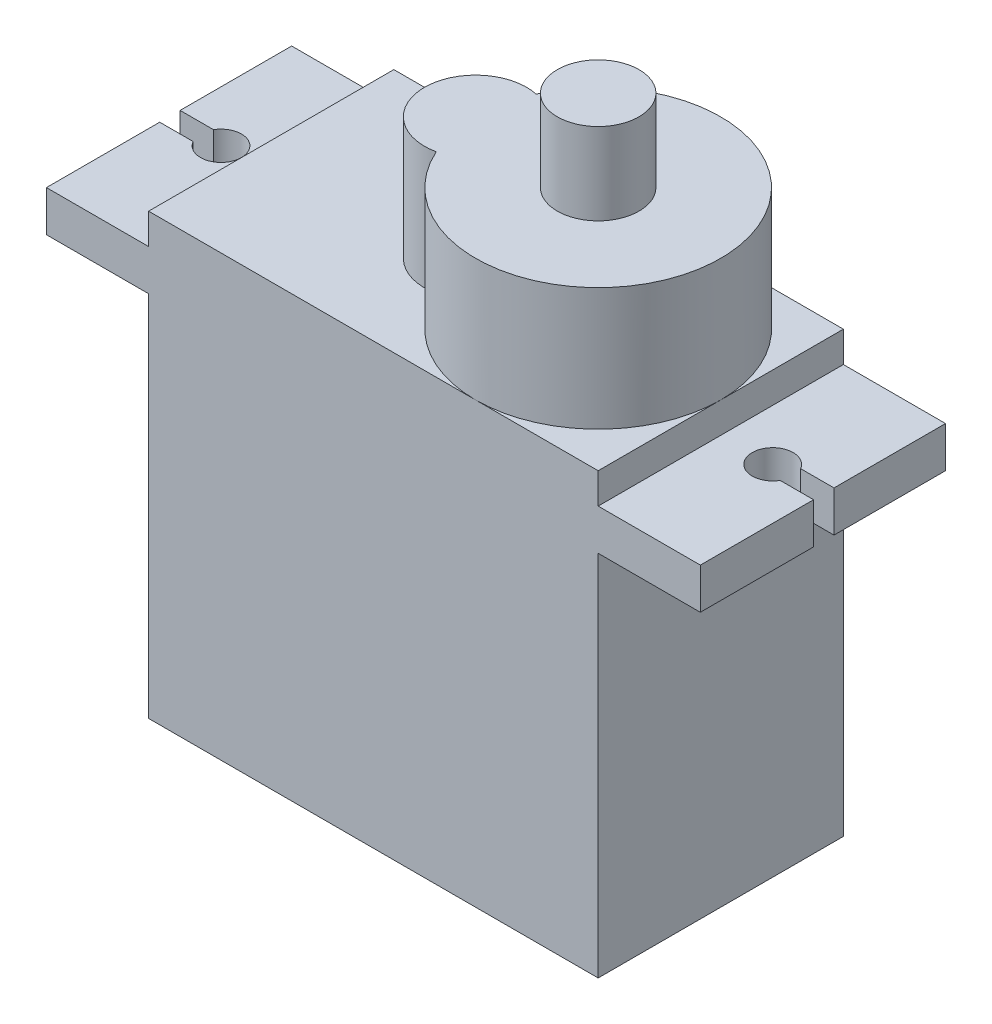
ISO-10303-21;
HEADER;
FILE_DESCRIPTION(('STEP AP214'),'2;1');
FILE_NAME('part.step','',(''),(''),'','','');
FILE_SCHEMA(('AUTOMOTIVE_DESIGN { 1 0 10303 214 1 1 1 1 }'));
ENDSEC;
DATA;
#1=APPLICATION_CONTEXT('core data for automotive mechanical design processes');
#2=APPLICATION_PROTOCOL_DEFINITION('international standard','automotive_design',2000,#1);
#3=PRODUCT_CONTEXT('',#1,'mechanical');
#4=PRODUCT('Part','Part','',(#3));
#5=PRODUCT_RELATED_PRODUCT_CATEGORY('part','',(#4));
#6=PRODUCT_DEFINITION_FORMATION('','',#4);
#7=PRODUCT_DEFINITION_CONTEXT('part definition',#1,'design');
#8=PRODUCT_DEFINITION('design','',#6,#7);
#9=PRODUCT_DEFINITION_SHAPE('','',#8);
#10=(LENGTH_UNIT() NAMED_UNIT(*) SI_UNIT(.MILLI.,.METRE.));
#11=(NAMED_UNIT(*) PLANE_ANGLE_UNIT() SI_UNIT($,.RADIAN.));
#12=(NAMED_UNIT(*) SI_UNIT($,.STERADIAN.) SOLID_ANGLE_UNIT());
#13=UNCERTAINTY_MEASURE_WITH_UNIT(LENGTH_MEASURE(1.E-05),#10,'distance_accuracy_value','');
#14=(GEOMETRIC_REPRESENTATION_CONTEXT(3) GLOBAL_UNCERTAINTY_ASSIGNED_CONTEXT((#13)) GLOBAL_UNIT_ASSIGNED_CONTEXT((#10,
#11,#12)) REPRESENTATION_CONTEXT('',''));
#15=CARTESIAN_POINT('',(0.,0.,0.));
#16=DIRECTION('',(0.,0.,1.));
#17=DIRECTION('',(1.,0.,0.));
#18=AXIS2_PLACEMENT_3D('',#15,#16,#17);
#19=CARTESIAN_POINT('',(16.,12.5368421052632,12.));
#20=DIRECTION('',(0.,1.,0.));
#21=DIRECTION('',(0.,0.,1.));
#22=AXIS2_PLACEMENT_3D('',#19,#20,#21);
#23=PLANE('',#22);
#24=DIRECTION('',(1.,0.,0.));
#25=VECTOR('',#24,1.);
#26=CARTESIAN_POINT('',(16.,12.5368421052632,5.45825614499163));
#27=LINE('',#26,#25);
#28=CARTESIAN_POINT('',(14.3660254037844,12.5368421052632,5.45825614499163));
#29=VERTEX_POINT('',#28);
#30=CARTESIAN_POINT('',(16.,12.5368421052632,5.45825614499163));
#31=VERTEX_POINT('',#30);
#32=EDGE_CURVE('E243',#29,#31,#27,.T.);
#33=ORIENTED_EDGE('',*,*,#32,.F.);
#34=CARTESIAN_POINT('',(13.5,12.5368421052632,5.95825614499163));
#35=DIRECTION('',(0.,1.,0.));
#36=DIRECTION('',(0.,0.,1.));
#37=AXIS2_PLACEMENT_3D('',#34,#35,#36);
#38=CIRCLE('',#37,1.);
#39=CARTESIAN_POINT('',(14.3660254037844,12.5368421052632,6.45825614499163));
#40=VERTEX_POINT('',#39);
#41=EDGE_CURVE('E199',#40,#29,#38,.F.);
#42=ORIENTED_EDGE('',*,*,#41,.F.);
#43=DIRECTION('',(-1.,0.,0.));
#44=VECTOR('',#43,1.);
#45=CARTESIAN_POINT('',(16.,12.5368421052632,6.45825614499163));
#46=LINE('',#45,#44);
#47=CARTESIAN_POINT('',(16.,12.5368421052632,6.45825614499163));
#48=VERTEX_POINT('',#47);
#49=EDGE_CURVE('E202',#48,#40,#46,.T.);
#50=ORIENTED_EDGE('',*,*,#49,.F.);
#51=DIRECTION('',(0.,0.,-1.));
#52=VECTOR('',#51,1.);
#53=CARTESIAN_POINT('',(16.,12.5368421052632,12.));
#54=LINE('',#53,#52);
#55=CARTESIAN_POINT('',(16.,12.5368421052632,12.));
#56=VERTEX_POINT('',#55);
#57=EDGE_CURVE('E358',#56,#48,#54,.T.);
#58=ORIENTED_EDGE('',*,*,#57,.F.);
#59=DIRECTION('',(1.,0.,0.));
#60=VECTOR('',#59,1.);
#61=CARTESIAN_POINT('',(16.,12.5368421052632,12.));
#62=LINE('',#61,#60);
#63=CARTESIAN_POINT('',(11.,12.5368421052632,12.));
#64=VERTEX_POINT('',#63);
#65=EDGE_CURVE('E280',#64,#56,#62,.T.);
#66=ORIENTED_EDGE('',*,*,#65,.F.);
#67=DIRECTION('',(0.,0.,-1.));
#68=VECTOR('',#67,1.);
#69=CARTESIAN_POINT('',(11.,12.5368421052632,12.));
#70=LINE('',#69,#68);
#71=CARTESIAN_POINT('',(11.,12.5368421052632,0.));
#72=VERTEX_POINT('',#71);
#73=EDGE_CURVE('E361',#64,#72,#70,.T.);
#74=ORIENTED_EDGE('',*,*,#73,.T.);
#75=DIRECTION('',(1.,0.,0.));
#76=VECTOR('',#75,1.);
#77=CARTESIAN_POINT('',(16.,12.5368421052632,0.));
#78=LINE('',#77,#76);
#79=CARTESIAN_POINT('',(16.,12.5368421052632,0.));
#80=VERTEX_POINT('',#79);
#81=EDGE_CURVE('E307',#72,#80,#78,.T.);
#82=ORIENTED_EDGE('',*,*,#81,.T.);
#83=EDGE_CURVE('E357',#31,#80,#54,.T.);
#84=ORIENTED_EDGE('',*,*,#83,.F.);
#85=EDGE_LOOP('',(#33,#42,#50,#58,#66,#74,#82,#84));
#86=FACE_BOUND('',#85,.T.);
#87=ADVANCED_FACE('F39',(#86),#23,.F.);
#88=CARTESIAN_POINT('',(16.,14.5368421052632,12.));
#89=DIRECTION('',(-1.,0.,0.));
#90=DIRECTION('',(0.,0.,1.));
#91=AXIS2_PLACEMENT_3D('',#88,#89,#90);
#92=PLANE('',#91);
#93=DIRECTION('',(0.,1.,0.));
#94=VECTOR('',#93,1.);
#95=CARTESIAN_POINT('',(16.,-5.46315789473684,5.45825614499163));
#96=LINE('',#95,#94);
#97=CARTESIAN_POINT('',(16.,14.5368421052632,5.45825614499163));
#98=VERTEX_POINT('',#97);
#99=EDGE_CURVE('E203',#31,#98,#96,.T.);
#100=ORIENTED_EDGE('',*,*,#99,.F.);
#101=ORIENTED_EDGE('',*,*,#83,.T.);
#102=DIRECTION('',(0.,1.,0.));
#103=VECTOR('',#102,1.);
#104=CARTESIAN_POINT('',(16.,14.5368421052632,0.));
#105=LINE('',#104,#103);
#106=CARTESIAN_POINT('',(16.,14.5368421052632,0.));
#107=VERTEX_POINT('',#106);
#108=EDGE_CURVE('E310',#80,#107,#105,.T.);
#109=ORIENTED_EDGE('',*,*,#108,.T.);
#110=DIRECTION('',(0.,0.,-1.));
#111=VECTOR('',#110,1.);
#112=CARTESIAN_POINT('',(16.,14.5368421052632,12.));
#113=LINE('',#112,#111);
#114=EDGE_CURVE('E354',#98,#107,#113,.T.);
#115=ORIENTED_EDGE('',*,*,#114,.F.);
#116=EDGE_LOOP('',(#100,#101,#109,#115));
#117=FACE_BOUND('',#116,.T.);
#118=ADVANCED_FACE('F449',(#117),#92,.F.);
#119=DIRECTION('',(0.,1.,0.));
#120=VECTOR('',#119,1.);
#121=CARTESIAN_POINT('',(16.,-5.46315789473684,6.45825614499163));
#122=LINE('',#121,#120);
#123=CARTESIAN_POINT('',(16.,14.5368421052632,6.45825614499163));
#124=VERTEX_POINT('',#123);
#125=EDGE_CURVE('E224',#48,#124,#122,.T.);
#126=ORIENTED_EDGE('',*,*,#125,.T.);
#127=CARTESIAN_POINT('',(16.,14.5368421052632,12.));
#128=VERTEX_POINT('',#127);
#129=EDGE_CURVE('E355',#128,#124,#113,.T.);
#130=ORIENTED_EDGE('',*,*,#129,.F.);
#131=DIRECTION('',(0.,1.,0.));
#132=VECTOR('',#131,1.);
#133=CARTESIAN_POINT('',(16.,14.5368421052632,12.));
#134=LINE('',#133,#132);
#135=EDGE_CURVE('E282',#56,#128,#134,.T.);
#136=ORIENTED_EDGE('',*,*,#135,.F.);
#137=ORIENTED_EDGE('',*,*,#57,.T.);
#138=EDGE_LOOP('',(#126,#130,#136,#137));
#139=FACE_BOUND('',#138,.T.);
#140=ADVANCED_FACE('F461',(#139),#92,.F.);
#141=CARTESIAN_POINT('',(16.,14.5368421052632,12.));
#142=DIRECTION('',(0.,-1.,0.));
#143=DIRECTION('',(1.,0.,0.));
#144=AXIS2_PLACEMENT_3D('',#141,#142,#143);
#145=PLANE('',#144);
#146=DIRECTION('',(1.,0.,0.));
#147=VECTOR('',#146,1.);
#148=CARTESIAN_POINT('',(14.3660254037844,14.5368421052632,5.45825614499163));
#149=LINE('',#148,#147);
#150=CARTESIAN_POINT('',(14.3660254037844,14.5368421052632,5.45825614499163));
#151=VERTEX_POINT('',#150);
#152=EDGE_CURVE('E206',#151,#98,#149,.T.);
#153=ORIENTED_EDGE('',*,*,#152,.T.);
#154=ORIENTED_EDGE('',*,*,#114,.T.);
#155=DIRECTION('',(-1.,0.,0.));
#156=VECTOR('',#155,1.);
#157=CARTESIAN_POINT('',(16.,14.5368421052632,0.));
#158=LINE('',#157,#156);
#159=CARTESIAN_POINT('',(11.,14.5368421052632,0.));
#160=VERTEX_POINT('',#159);
#161=EDGE_CURVE('E313',#107,#160,#158,.T.);
#162=ORIENTED_EDGE('',*,*,#161,.T.);
#163=DIRECTION('',(0.,0.,-1.));
#164=VECTOR('',#163,1.);
#165=CARTESIAN_POINT('',(11.,14.5368421052632,12.));
#166=LINE('',#165,#164);
#167=CARTESIAN_POINT('',(11.,14.5368421052632,12.));
#168=VERTEX_POINT('',#167);
#169=EDGE_CURVE('E351',#168,#160,#166,.T.);
#170=ORIENTED_EDGE('',*,*,#169,.F.);
#171=DIRECTION('',(-1.,0.,0.));
#172=VECTOR('',#171,1.);
#173=CARTESIAN_POINT('',(16.,14.5368421052632,12.));
#174=LINE('',#173,#172);
#175=EDGE_CURVE('E284',#128,#168,#174,.T.);
#176=ORIENTED_EDGE('',*,*,#175,.F.);
#177=ORIENTED_EDGE('',*,*,#129,.T.);
#178=DIRECTION('',(-1.,0.,0.));
#179=VECTOR('',#178,1.);
#180=CARTESIAN_POINT('',(14.3660254037844,14.5368421052632,6.45825614499163));
#181=LINE('',#180,#179);
#182=CARTESIAN_POINT('',(14.3660254037844,14.5368421052632,6.45825614499163));
#183=VERTEX_POINT('',#182);
#184=EDGE_CURVE('E211',#124,#183,#181,.T.);
#185=ORIENTED_EDGE('',*,*,#184,.T.);
#186=CARTESIAN_POINT('',(13.5,14.5368421052632,5.95825614499163));
#187=DIRECTION('',(0.,-1.,0.));
#188=DIRECTION('',(0.,0.,-1.));
#189=AXIS2_PLACEMENT_3D('',#186,#187,#188);
#190=CIRCLE('',#189,1.);
#191=EDGE_CURVE('E54',#183,#151,#190,.T.);
#192=ORIENTED_EDGE('',*,*,#191,.T.);
#193=EDGE_LOOP('',(#153,#154,#162,#170,#176,#177,#185,#192));
#194=FACE_BOUND('',#193,.T.);
#195=ADVANCED_FACE('F214',(#194),#145,.F.);
#196=CARTESIAN_POINT('',(-16.,14.5368421052632,12.));
#197=DIRECTION('',(1.,0.,0.));
#198=DIRECTION('',(0.,0.,-1.));
#199=AXIS2_PLACEMENT_3D('',#196,#197,#198);
#200=PLANE('',#199);
#201=DIRECTION('',(0.,1.,0.));
#202=VECTOR('',#201,1.);
#203=CARTESIAN_POINT('',(-16.0000000000001,-5.46315789473684,6.45825614499163));
#204=LINE('',#203,#202);
#205=CARTESIAN_POINT('',(-16.0000000000001,12.5368421052632,6.45825614499163));
#206=VERTEX_POINT('',#205);
#207=CARTESIAN_POINT('',(-16.0000000000001,14.5368421052632,6.45825614499163));
#208=VERTEX_POINT('',#207);
#209=EDGE_CURVE('E216',#206,#208,#204,.T.);
#210=ORIENTED_EDGE('',*,*,#209,.F.);
#211=DIRECTION('',(0.,0.,-1.));
#212=VECTOR('',#211,1.);
#213=CARTESIAN_POINT('',(-16.,12.5368421052632,12.));
#214=LINE('',#213,#212);
#215=CARTESIAN_POINT('',(-16.,12.5368421052632,12.));
#216=VERTEX_POINT('',#215);
#217=EDGE_CURVE('E334',#216,#206,#214,.T.);
#218=ORIENTED_EDGE('',*,*,#217,.F.);
#219=DIRECTION('',(0.,-1.,0.));
#220=VECTOR('',#219,1.);
#221=CARTESIAN_POINT('',(-16.,14.5368421052632,12.));
#222=LINE('',#221,#220);
#223=CARTESIAN_POINT('',(-16.,14.5368421052632,12.));
#224=VERTEX_POINT('',#223);
#225=EDGE_CURVE('E296',#224,#216,#222,.T.);
#226=ORIENTED_EDGE('',*,*,#225,.F.);
#227=DIRECTION('',(0.,0.,-1.));
#228=VECTOR('',#227,1.);
#229=CARTESIAN_POINT('',(-16.,14.5368421052632,12.));
#230=LINE('',#229,#228);
#231=EDGE_CURVE('E338',#224,#208,#230,.T.);
#232=ORIENTED_EDGE('',*,*,#231,.T.);
#233=EDGE_LOOP('',(#210,#218,#226,#232));
#234=FACE_BOUND('',#233,.T.);
#235=ADVANCED_FACE('F412',(#234),#200,.F.);
#236=DIRECTION('',(0.,1.,0.));
#237=VECTOR('',#236,1.);
#238=CARTESIAN_POINT('',(-16.,-5.46315789473684,5.45825614499163));
#239=LINE('',#238,#237);
#240=CARTESIAN_POINT('',(-16.,12.5368421052632,5.45825614499163));
#241=VERTEX_POINT('',#240);
#242=CARTESIAN_POINT('',(-16.,14.5368421052632,5.45825614499163));
#243=VERTEX_POINT('',#242);
#244=EDGE_CURVE('E218',#241,#243,#239,.T.);
#245=ORIENTED_EDGE('',*,*,#244,.T.);
#246=CARTESIAN_POINT('',(-16.,14.5368421052632,0.));
#247=VERTEX_POINT('',#246);
#248=EDGE_CURVE('E337',#243,#247,#230,.T.);
#249=ORIENTED_EDGE('',*,*,#248,.T.);
#250=DIRECTION('',(0.,-1.,0.));
#251=VECTOR('',#250,1.);
#252=CARTESIAN_POINT('',(-16.,14.5368421052632,0.));
#253=LINE('',#252,#251);
#254=CARTESIAN_POINT('',(-16.,12.5368421052632,0.));
#255=VERTEX_POINT('',#254);
#256=EDGE_CURVE('E327',#247,#255,#253,.T.);
#257=ORIENTED_EDGE('',*,*,#256,.T.);
#258=EDGE_CURVE('E333',#241,#255,#214,.T.);
#259=ORIENTED_EDGE('',*,*,#258,.F.);
#260=EDGE_LOOP('',(#245,#249,#257,#259));
#261=FACE_BOUND('',#260,.T.);
#262=ADVANCED_FACE('F390',(#261),#200,.F.);
#263=CARTESIAN_POINT('',(11.,16.0368421052632,12.));
#264=DIRECTION('',(0.,-1.,0.));
#265=DIRECTION('',(0.,0.,-1.));
#266=AXIS2_PLACEMENT_3D('',#263,#264,#265);
#267=PLANE('',#266);
#268=CARTESIAN_POINT('',(-1.,16.0368421052632,6.));
#269=DIRECTION('',(0.,1.,0.));
#270=DIRECTION('',(0.,0.,1.));
#271=AXIS2_PLACEMENT_3D('',#268,#269,#270);
#272=CIRCLE('',#271,2.5);
#273=CARTESIAN_POINT('',(-0.479166666666667,16.0368421052632,3.55485529285302));
#274=VERTEX_POINT('',#273);
#275=CARTESIAN_POINT('',(-0.479166666666667,16.0368421052632,8.44514470714698));
#276=VERTEX_POINT('',#275);
#277=EDGE_CURVE('E250',#274,#276,#272,.T.);
#278=ORIENTED_EDGE('',*,*,#277,.F.);
#279=CARTESIAN_POINT('',(5.,16.0368421052632,6.));
#280=DIRECTION('',(0.,1.,0.));
#281=DIRECTION('',(0.,0.,1.));
#282=AXIS2_PLACEMENT_3D('',#279,#280,#281);
#283=CIRCLE('',#282,6.);
#284=CARTESIAN_POINT('',(5.,16.0368421052632,0.));
#285=VERTEX_POINT('',#284);
#286=EDGE_CURVE('E265',#285,#274,#283,.T.);
#287=ORIENTED_EDGE('',*,*,#286,.F.);
#288=DIRECTION('',(-1.,0.,0.));
#289=VECTOR('',#288,1.);
#290=CARTESIAN_POINT('',(11.,16.0368421052632,0.));
#291=LINE('',#290,#289);
#292=CARTESIAN_POINT('',(-11.,16.0368421052632,0.));
#293=VERTEX_POINT('',#292);
#294=EDGE_CURVE('E318',#285,#293,#291,.T.);
#295=ORIENTED_EDGE('',*,*,#294,.T.);
#296=DIRECTION('',(0.,0.,-1.));
#297=VECTOR('',#296,1.);
#298=CARTESIAN_POINT('',(-11.,16.0368421052632,12.));
#299=LINE('',#298,#297);
#300=CARTESIAN_POINT('',(-11.,16.0368421052632,12.));
#301=VERTEX_POINT('',#300);
#302=EDGE_CURVE('E344',#301,#293,#299,.T.);
#303=ORIENTED_EDGE('',*,*,#302,.F.);
#304=DIRECTION('',(-1.,0.,0.));
#305=VECTOR('',#304,1.);
#306=CARTESIAN_POINT('',(11.,16.0368421052632,12.));
#307=LINE('',#306,#305);
#308=CARTESIAN_POINT('',(5.,16.0368421052632,12.));
#309=VERTEX_POINT('',#308);
#310=EDGE_CURVE('E288',#309,#301,#307,.T.);
#311=ORIENTED_EDGE('',*,*,#310,.F.);
#312=EDGE_CURVE('E257',#276,#309,#283,.T.);
#313=ORIENTED_EDGE('',*,*,#312,.F.);
#314=EDGE_LOOP('',(#278,#287,#295,#303,#311,#313));
#315=FACE_BOUND('',#314,.T.);
#316=ADVANCED_FACE('F440',(#315),#267,.F.);
#317=CARTESIAN_POINT('',(11.,16.0368421052632,6.));
#318=VERTEX_POINT('',#317);
#319=EDGE_CURVE('E264',#309,#318,#283,.T.);
#320=ORIENTED_EDGE('',*,*,#319,.F.);
#321=CARTESIAN_POINT('',(11.,16.0368421052632,12.));
#322=VERTEX_POINT('',#321);
#323=EDGE_CURVE('E289',#322,#309,#307,.T.);
#324=ORIENTED_EDGE('',*,*,#323,.F.);
#325=DIRECTION('',(0.,0.,-1.));
#326=VECTOR('',#325,1.);
#327=CARTESIAN_POINT('',(11.,16.0368421052632,12.));
#328=LINE('',#327,#326);
#329=EDGE_CURVE('E348',#322,#318,#328,.T.);
#330=ORIENTED_EDGE('',*,*,#329,.T.);
#331=EDGE_LOOP('',(#320,#324,#330));
#332=FACE_BOUND('',#331,.T.);
#333=ADVANCED_FACE('F438',(#332),#267,.F.);
#334=CARTESIAN_POINT('',(-11.,-5.46315789473684,12.));
#335=DIRECTION('',(1.,0.,0.));
#336=DIRECTION('',(0.,1.,0.));
#337=AXIS2_PLACEMENT_3D('',#334,#335,#336);
#338=PLANE('',#337);
#339=DIRECTION('',(0.,-1.,0.));
#340=VECTOR('',#339,1.);
#341=CARTESIAN_POINT('',(-11.,-5.46315789473684,0.));
#342=LINE('',#341,#340);
#343=CARTESIAN_POINT('',(-11.,12.5368421052632,0.));
#344=VERTEX_POINT('',#343);
#345=CARTESIAN_POINT('',(-11.,-5.46315789473684,0.));
#346=VERTEX_POINT('',#345);
#347=EDGE_CURVE('E271',#344,#346,#342,.T.);
#348=ORIENTED_EDGE('',*,*,#347,.T.);
#349=DIRECTION('',(0.,0.,-1.));
#350=VECTOR('',#349,1.);
#351=CARTESIAN_POINT('',(-11.,-5.46315789473684,12.));
#352=LINE('',#351,#350);
#353=CARTESIAN_POINT('',(-11.,-5.46315789473684,12.));
#354=VERTEX_POINT('',#353);
#355=EDGE_CURVE('E367',#354,#346,#352,.T.);
#356=ORIENTED_EDGE('',*,*,#355,.F.);
#357=DIRECTION('',(0.,-1.,0.));
#358=VECTOR('',#357,1.);
#359=CARTESIAN_POINT('',(-11.,-5.46315789473684,12.));
#360=LINE('',#359,#358);
#361=CARTESIAN_POINT('',(-11.,12.5368421052632,12.));
#362=VERTEX_POINT('',#361);
#363=EDGE_CURVE('E272',#362,#354,#360,.T.);
#364=ORIENTED_EDGE('',*,*,#363,.F.);
#365=DIRECTION('',(0.,0.,-1.));
#366=VECTOR('',#365,1.);
#367=CARTESIAN_POINT('',(-11.,12.5368421052632,12.));
#368=LINE('',#367,#366);
#369=EDGE_CURVE('E300',#362,#344,#368,.T.);
#370=ORIENTED_EDGE('',*,*,#369,.T.);
#371=EDGE_LOOP('',(#348,#356,#364,#370));
#372=FACE_BOUND('',#371,.T.);
#373=ADVANCED_FACE('F41',(#372),#338,.F.);
#374=CARTESIAN_POINT('',(11.,-5.46315789473683,12.));
#375=DIRECTION('',(0.,1.,0.));
#376=DIRECTION('',(-1.,0.,0.));
#377=AXIS2_PLACEMENT_3D('',#374,#375,#376);
#378=PLANE('',#377);
#379=DIRECTION('',(1.,0.,0.));
#380=VECTOR('',#379,1.);
#381=CARTESIAN_POINT('',(11.,-5.46315789473683,0.));
#382=LINE('',#381,#380);
#383=CARTESIAN_POINT('',(11.,-5.46315789473683,0.));
#384=VERTEX_POINT('',#383);
#385=EDGE_CURVE('E303',#346,#384,#382,.T.);
#386=ORIENTED_EDGE('',*,*,#385,.T.);
#387=DIRECTION('',(0.,0.,-1.));
#388=VECTOR('',#387,1.);
#389=CARTESIAN_POINT('',(11.,-5.46315789473683,12.));
#390=LINE('',#389,#388);
#391=CARTESIAN_POINT('',(11.,-5.46315789473683,12.));
#392=VERTEX_POINT('',#391);
#393=EDGE_CURVE('E364',#392,#384,#390,.T.);
#394=ORIENTED_EDGE('',*,*,#393,.F.);
#395=DIRECTION('',(1.,0.,0.));
#396=VECTOR('',#395,1.);
#397=CARTESIAN_POINT('',(11.,-5.46315789473683,12.));
#398=LINE('',#397,#396);
#399=EDGE_CURVE('E275',#354,#392,#398,.T.);
#400=ORIENTED_EDGE('',*,*,#399,.F.);
#401=ORIENTED_EDGE('',*,*,#355,.T.);
#402=EDGE_LOOP('',(#386,#394,#400,#401));
#403=FACE_BOUND('',#402,.T.);
#404=ADVANCED_FACE('F405',(#403),#378,.F.);
#405=CARTESIAN_POINT('',(11.,-5.46315789473683,12.));
#406=DIRECTION('',(-1.,0.,0.));
#407=DIRECTION('',(0.,0.,1.));
#408=AXIS2_PLACEMENT_3D('',#405,#406,#407);
#409=PLANE('',#408);
#410=DIRECTION('',(0.,1.,0.));
#411=VECTOR('',#410,1.);
#412=CARTESIAN_POINT('',(11.,-5.46315789473683,0.));
#413=LINE('',#412,#411);
#414=EDGE_CURVE('E305',#384,#72,#413,.T.);
#415=ORIENTED_EDGE('',*,*,#414,.T.);
#416=ORIENTED_EDGE('',*,*,#73,.F.);
#417=DIRECTION('',(0.,1.,0.));
#418=VECTOR('',#417,1.);
#419=CARTESIAN_POINT('',(11.,-5.46315789473683,12.));
#420=LINE('',#419,#418);
#421=EDGE_CURVE('E278',#392,#64,#420,.T.);
#422=ORIENTED_EDGE('',*,*,#421,.F.);
#423=ORIENTED_EDGE('',*,*,#393,.T.);
#424=EDGE_LOOP('',(#415,#416,#422,#423));
#425=FACE_BOUND('',#424,.T.);
#426=ADVANCED_FACE('F456',(#425),#409,.F.);
#427=CARTESIAN_POINT('',(11.,16.0368421052632,12.));
#428=DIRECTION('',(-1.,0.,0.));
#429=DIRECTION('',(0.,0.,1.));
#430=AXIS2_PLACEMENT_3D('',#427,#428,#429);
#431=PLANE('',#430);
#432=DIRECTION('',(0.,1.,0.));
#433=VECTOR('',#432,1.);
#434=CARTESIAN_POINT('',(11.,16.0368421052632,0.));
#435=LINE('',#434,#433);
#436=CARTESIAN_POINT('',(11.,16.0368421052632,0.));
#437=VERTEX_POINT('',#436);
#438=EDGE_CURVE('E315',#160,#437,#435,.T.);
#439=ORIENTED_EDGE('',*,*,#438,.T.);
#440=EDGE_CURVE('E347',#318,#437,#328,.T.);
#441=ORIENTED_EDGE('',*,*,#440,.F.);
#442=ORIENTED_EDGE('',*,*,#329,.F.);
#443=DIRECTION('',(0.,1.,0.));
#444=VECTOR('',#443,1.);
#445=CARTESIAN_POINT('',(11.,16.0368421052632,12.));
#446=LINE('',#445,#444);
#447=EDGE_CURVE('E286',#168,#322,#446,.T.);
#448=ORIENTED_EDGE('',*,*,#447,.F.);
#449=ORIENTED_EDGE('',*,*,#169,.T.);
#450=EDGE_LOOP('',(#439,#441,#442,#448,#449));
#451=FACE_BOUND('',#450,.T.);
#452=ADVANCED_FACE('F445',(#451),#431,.F.);
#453=EDGE_CURVE('E429',#318,#285,#283,.T.);
#454=ORIENTED_EDGE('',*,*,#453,.F.);
#455=ORIENTED_EDGE('',*,*,#440,.T.);
#456=EDGE_CURVE('E319',#437,#285,#291,.T.);
#457=ORIENTED_EDGE('',*,*,#456,.T.);
#458=EDGE_LOOP('',(#454,#455,#457));
#459=FACE_BOUND('',#458,.T.);
#460=ADVANCED_FACE('F428',(#459),#267,.F.);
#461=CARTESIAN_POINT('',(-11.,16.0368421052632,12.));
#462=DIRECTION('',(1.,0.,0.));
#463=DIRECTION('',(0.,0.,-1.));
#464=AXIS2_PLACEMENT_3D('',#461,#462,#463);
#465=PLANE('',#464);
#466=DIRECTION('',(0.,-1.,0.));
#467=VECTOR('',#466,1.);
#468=CARTESIAN_POINT('',(-11.,16.0368421052632,0.));
#469=LINE('',#468,#467);
#470=CARTESIAN_POINT('',(-11.,14.5368421052632,0.));
#471=VERTEX_POINT('',#470);
#472=EDGE_CURVE('E322',#293,#471,#469,.T.);
#473=ORIENTED_EDGE('',*,*,#472,.T.);
#474=DIRECTION('',(0.,0.,-1.));
#475=VECTOR('',#474,1.);
#476=CARTESIAN_POINT('',(-11.,14.5368421052632,12.));
#477=LINE('',#476,#475);
#478=CARTESIAN_POINT('',(-11.,14.5368421052632,12.));
#479=VERTEX_POINT('',#478);
#480=EDGE_CURVE('E341',#479,#471,#477,.T.);
#481=ORIENTED_EDGE('',*,*,#480,.F.);
#482=DIRECTION('',(0.,-1.,0.));
#483=VECTOR('',#482,1.);
#484=CARTESIAN_POINT('',(-11.,16.0368421052632,12.));
#485=LINE('',#484,#483);
#486=EDGE_CURVE('E292',#301,#479,#485,.T.);
#487=ORIENTED_EDGE('',*,*,#486,.F.);
#488=ORIENTED_EDGE('',*,*,#302,.T.);
#489=EDGE_LOOP('',(#473,#481,#487,#488));
#490=FACE_BOUND('',#489,.T.);
#491=ADVANCED_FACE('F420',(#490),#465,.F.);
#492=CARTESIAN_POINT('',(-11.,14.5368421052632,12.));
#493=DIRECTION('',(0.,-1.,0.));
#494=DIRECTION('',(0.,0.,-1.));
#495=AXIS2_PLACEMENT_3D('',#492,#493,#494);
#496=PLANE('',#495);
#497=DIRECTION('',(-1.,0.,0.));
#498=VECTOR('',#497,1.);
#499=CARTESIAN_POINT('',(-14.3660254037845,14.5368421052632,6.45825614499163));
#500=LINE('',#499,#498);
#501=CARTESIAN_POINT('',(-14.3660254037845,14.5368421052632,6.45825614499163));
#502=VERTEX_POINT('',#501);
#503=EDGE_CURVE('E228',#502,#208,#500,.T.);
#504=ORIENTED_EDGE('',*,*,#503,.T.);
#505=ORIENTED_EDGE('',*,*,#231,.F.);
#506=DIRECTION('',(-1.,0.,0.));
#507=VECTOR('',#506,1.);
#508=CARTESIAN_POINT('',(-11.,14.5368421052632,12.));
#509=LINE('',#508,#507);
#510=EDGE_CURVE('E294',#479,#224,#509,.T.);
#511=ORIENTED_EDGE('',*,*,#510,.F.);
#512=ORIENTED_EDGE('',*,*,#480,.T.);
#513=DIRECTION('',(-1.,0.,0.));
#514=VECTOR('',#513,1.);
#515=CARTESIAN_POINT('',(-11.,14.5368421052632,0.));
#516=LINE('',#515,#514);
#517=EDGE_CURVE('E324',#471,#247,#516,.T.);
#518=ORIENTED_EDGE('',*,*,#517,.T.);
#519=ORIENTED_EDGE('',*,*,#248,.F.);
#520=DIRECTION('',(1.,0.,0.));
#521=VECTOR('',#520,1.);
#522=CARTESIAN_POINT('',(-14.3660254037845,14.5368421052632,5.45825614499163));
#523=LINE('',#522,#521);
#524=CARTESIAN_POINT('',(-14.3660254037845,14.5368421052632,5.45825614499163));
#525=VERTEX_POINT('',#524);
#526=EDGE_CURVE('E231',#243,#525,#523,.T.);
#527=ORIENTED_EDGE('',*,*,#526,.T.);
#528=CARTESIAN_POINT('',(-13.5,14.5368421052632,5.95825614499163));
#529=DIRECTION('',(0.,-1.,0.));
#530=DIRECTION('',(0.,0.,1.));
#531=AXIS2_PLACEMENT_3D('',#528,#529,#530);
#532=CIRCLE('',#531,1.);
#533=EDGE_CURVE('E234',#525,#502,#532,.T.);
#534=ORIENTED_EDGE('',*,*,#533,.T.);
#535=EDGE_LOOP('',(#504,#505,#511,#512,#518,#519,#527,#534));
#536=FACE_BOUND('',#535,.T.);
#537=ADVANCED_FACE('F387',(#536),#496,.F.);
#538=CARTESIAN_POINT('',(-11.,12.5368421052632,12.));
#539=DIRECTION('',(0.,1.,0.));
#540=DIRECTION('',(0.,0.,1.));
#541=AXIS2_PLACEMENT_3D('',#538,#539,#540);
#542=PLANE('',#541);
#543=DIRECTION('',(-1.,0.,0.));
#544=VECTOR('',#543,1.);
#545=CARTESIAN_POINT('',(-11.,12.5368421052632,6.45825614499163));
#546=LINE('',#545,#544);
#547=CARTESIAN_POINT('',(-14.3660254037845,12.5368421052632,6.45825614499163));
#548=VERTEX_POINT('',#547);
#549=EDGE_CURVE('E11',#548,#206,#546,.T.);
#550=ORIENTED_EDGE('',*,*,#549,.F.);
#551=CARTESIAN_POINT('',(-13.5,12.5368421052632,5.95825614499163));
#552=DIRECTION('',(0.,1.,0.));
#553=DIRECTION('',(0.,0.,1.));
#554=AXIS2_PLACEMENT_3D('',#551,#552,#553);
#555=CIRCLE('',#554,1.);
#556=CARTESIAN_POINT('',(-14.3660254037845,12.5368421052632,5.45825614499163));
#557=VERTEX_POINT('',#556);
#558=EDGE_CURVE('E370',#557,#548,#555,.F.);
#559=ORIENTED_EDGE('',*,*,#558,.F.);
#560=DIRECTION('',(1.,0.,0.));
#561=VECTOR('',#560,1.);
#562=CARTESIAN_POINT('',(-11.,12.5368421052632,5.45825614499163));
#563=LINE('',#562,#561);
#564=EDGE_CURVE('E47',#241,#557,#563,.T.);
#565=ORIENTED_EDGE('',*,*,#564,.F.);
#566=ORIENTED_EDGE('',*,*,#258,.T.);
#567=DIRECTION('',(1.,0.,0.));
#568=VECTOR('',#567,1.);
#569=CARTESIAN_POINT('',(-11.,12.5368421052632,0.));
#570=LINE('',#569,#568);
#571=EDGE_CURVE('E276',#255,#344,#570,.T.);
#572=ORIENTED_EDGE('',*,*,#571,.T.);
#573=ORIENTED_EDGE('',*,*,#369,.F.);
#574=DIRECTION('',(1.,0.,0.));
#575=VECTOR('',#574,1.);
#576=CARTESIAN_POINT('',(-11.,12.5368421052632,12.));
#577=LINE('',#576,#575);
#578=EDGE_CURVE('E298',#216,#362,#577,.T.);
#579=ORIENTED_EDGE('',*,*,#578,.F.);
#580=ORIENTED_EDGE('',*,*,#217,.T.);
#581=EDGE_LOOP('',(#550,#559,#565,#566,#572,#573,#579,#580));
#582=FACE_BOUND('',#581,.T.);
#583=ADVANCED_FACE('F378',(#582),#542,.F.);
#584=CARTESIAN_POINT('',(0.,0.,12.));
#585=DIRECTION('',(0.,0.,1.));
#586=DIRECTION('',(1.,0.,0.));
#587=AXIS2_PLACEMENT_3D('',#584,#585,#586);
#588=PLANE('',#587);
#589=ORIENTED_EDGE('',*,*,#363,.T.);
#590=ORIENTED_EDGE('',*,*,#399,.T.);
#591=ORIENTED_EDGE('',*,*,#421,.T.);
#592=ORIENTED_EDGE('',*,*,#65,.T.);
#593=ORIENTED_EDGE('',*,*,#135,.T.);
#594=ORIENTED_EDGE('',*,*,#175,.T.);
#595=ORIENTED_EDGE('',*,*,#447,.T.);
#596=ORIENTED_EDGE('',*,*,#323,.T.);
#597=ORIENTED_EDGE('',*,*,#310,.T.);
#598=ORIENTED_EDGE('',*,*,#486,.T.);
#599=ORIENTED_EDGE('',*,*,#510,.T.);
#600=ORIENTED_EDGE('',*,*,#225,.T.);
#601=ORIENTED_EDGE('',*,*,#578,.T.);
#602=EDGE_LOOP('',(#589,#590,#591,#592,#593,#594,#595,#596,#597,#598,#599,#600,#601));
#603=FACE_BOUND('',#602,.T.);
#604=ADVANCED_FACE('F408',(#603),#588,.T.);
#605=CARTESIAN_POINT('',(0.,0.,0.));
#606=DIRECTION('',(0.,0.,1.));
#607=DIRECTION('',(1.,0.,0.));
#608=AXIS2_PLACEMENT_3D('',#605,#606,#607);
#609=PLANE('',#608);
#610=ORIENTED_EDGE('',*,*,#347,.F.);
#611=ORIENTED_EDGE('',*,*,#571,.F.);
#612=ORIENTED_EDGE('',*,*,#256,.F.);
#613=ORIENTED_EDGE('',*,*,#517,.F.);
#614=ORIENTED_EDGE('',*,*,#472,.F.);
#615=ORIENTED_EDGE('',*,*,#294,.F.);
#616=ORIENTED_EDGE('',*,*,#456,.F.);
#617=ORIENTED_EDGE('',*,*,#438,.F.);
#618=ORIENTED_EDGE('',*,*,#161,.F.);
#619=ORIENTED_EDGE('',*,*,#108,.F.);
#620=ORIENTED_EDGE('',*,*,#81,.F.);
#621=ORIENTED_EDGE('',*,*,#414,.F.);
#622=ORIENTED_EDGE('',*,*,#385,.F.);
#623=EDGE_LOOP('',(#610,#611,#612,#613,#614,#615,#616,#617,#618,#619,#620,#621,#622));
#624=FACE_BOUND('',#623,.T.);
#625=ADVANCED_FACE('F400',(#624),#609,.F.);
#626=CARTESIAN_POINT('',(-1.,22.0368421052632,6.));
#627=DIRECTION('',(0.,-1.,0.));
#628=DIRECTION('',(0.,0.,-1.));
#629=AXIS2_PLACEMENT_3D('',#626,#627,#628);
#630=CYLINDRICAL_SURFACE('',#629,2.5);
#631=ORIENTED_EDGE('',*,*,#277,.T.);
#632=DIRECTION('',(0.,-1.,0.));
#633=VECTOR('',#632,1.);
#634=CARTESIAN_POINT('',(-0.479166666666667,22.0368421052632,8.44514470714698));
#635=LINE('',#634,#633);
#636=CARTESIAN_POINT('',(-0.479166666666667,22.0368421052632,8.44514470714698));
#637=VERTEX_POINT('',#636);
#638=EDGE_CURVE('E268',#637,#276,#635,.T.);
#639=ORIENTED_EDGE('',*,*,#638,.F.);
#640=CARTESIAN_POINT('',(-1.,22.0368421052632,6.));
#641=DIRECTION('',(0.,1.,0.));
#642=DIRECTION('',(0.,0.,1.));
#643=AXIS2_PLACEMENT_3D('',#640,#641,#642);
#644=CIRCLE('',#643,2.5);
#645=CARTESIAN_POINT('',(-0.479166666666667,22.0368421052632,3.55485529285302));
#646=VERTEX_POINT('',#645);
#647=EDGE_CURVE('E253',#646,#637,#644,.T.);
#648=ORIENTED_EDGE('',*,*,#647,.F.);
#649=DIRECTION('',(0.,-1.,0.));
#650=VECTOR('',#649,1.);
#651=CARTESIAN_POINT('',(-0.479166666666667,22.0368421052632,3.55485529285302));
#652=LINE('',#651,#650);
#653=EDGE_CURVE('E259',#646,#274,#652,.T.);
#654=ORIENTED_EDGE('',*,*,#653,.T.);
#655=EDGE_LOOP('',(#631,#639,#648,#654));
#656=FACE_BOUND('',#655,.T.);
#657=ADVANCED_FACE('F556',(#656),#630,.T.);
#658=CARTESIAN_POINT('',(5.,22.0368421052632,6.));
#659=DIRECTION('',(0.,-1.,0.));
#660=DIRECTION('',(0.,0.,-1.));
#661=AXIS2_PLACEMENT_3D('',#658,#659,#660);
#662=CYLINDRICAL_SURFACE('',#661,6.);
#663=ORIENTED_EDGE('',*,*,#312,.T.);
#664=ORIENTED_EDGE('',*,*,#319,.T.);
#665=ORIENTED_EDGE('',*,*,#453,.T.);
#666=ORIENTED_EDGE('',*,*,#286,.T.);
#667=ORIENTED_EDGE('',*,*,#653,.F.);
#668=CARTESIAN_POINT('',(5.,22.0368421052632,6.));
#669=DIRECTION('',(0.,1.,0.));
#670=DIRECTION('',(0.,0.,1.));
#671=AXIS2_PLACEMENT_3D('',#668,#669,#670);
#672=CIRCLE('',#671,6.);
#673=EDGE_CURVE('E256',#637,#646,#672,.T.);
#674=ORIENTED_EDGE('',*,*,#673,.F.);
#675=ORIENTED_EDGE('',*,*,#638,.T.);
#676=EDGE_LOOP('',(#663,#664,#665,#666,#667,#674,#675));
#677=FACE_BOUND('',#676,.T.);
#678=ADVANCED_FACE('F434',(#677),#662,.T.);
#679=CARTESIAN_POINT('',(2.,22.0368421052632,6.));
#680=DIRECTION('',(0.,1.,0.));
#681=DIRECTION('',(0.,0.,1.));
#682=AXIS2_PLACEMENT_3D('',#679,#680,#681);
#683=PLANE('',#682);
#684=CARTESIAN_POINT('',(5.,22.0368421052632,6.));
#685=DIRECTION('',(0.,1.,0.));
#686=DIRECTION('',(-1.,0.,0.));
#687=AXIS2_PLACEMENT_3D('',#684,#685,#686);
#688=CIRCLE('',#687,2.);
#689=CARTESIAN_POINT('',(3.,22.0368421052632,6.));
#690=VERTEX_POINT('',#689);
#691=EDGE_CURVE('E246',#690,#690,#688,.T.);
#692=ORIENTED_EDGE('',*,*,#691,.F.);
#693=EDGE_LOOP('',(#692));
#694=FACE_BOUND('',#693,.T.);
#695=ORIENTED_EDGE('',*,*,#647,.T.);
#696=ORIENTED_EDGE('',*,*,#673,.T.);
#697=EDGE_LOOP('',(#695,#696));
#698=FACE_BOUND('',#697,.T.);
#699=ADVANCED_FACE('F538',(#694,#698),#683,.T.);
#700=CARTESIAN_POINT('',(5.,26.0368421052632,6.));
#701=DIRECTION('',(0.,-1.,0.));
#702=DIRECTION('',(1.,0.,0.));
#703=AXIS2_PLACEMENT_3D('',#700,#701,#702);
#704=CYLINDRICAL_SURFACE('',#703,2.);
#705=CARTESIAN_POINT('',(5.,26.0368421052632,6.));
#706=DIRECTION('',(0.,1.,0.));
#707=DIRECTION('',(-1.,0.,0.));
#708=AXIS2_PLACEMENT_3D('',#705,#706,#707);
#709=CIRCLE('',#708,2.);
#710=CARTESIAN_POINT('',(3.,26.0368421052632,6.));
#711=VERTEX_POINT('',#710);
#712=EDGE_CURVE('E247',#711,#711,#709,.T.);
#713=ORIENTED_EDGE('',*,*,#712,.F.);
#714=EDGE_LOOP('',(#713));
#715=FACE_BOUND('',#714,.T.);
#716=ORIENTED_EDGE('',*,*,#691,.T.);
#717=EDGE_LOOP('',(#716));
#718=FACE_BOUND('',#717,.T.);
#719=ADVANCED_FACE('F527',(#715,#718),#704,.T.);
#720=CARTESIAN_POINT('',(5.,26.0368421052632,6.));
#721=DIRECTION('',(0.,1.,0.));
#722=DIRECTION('',(-1.,0.,0.));
#723=AXIS2_PLACEMENT_3D('',#720,#721,#722);
#724=PLANE('',#723);
#725=ORIENTED_EDGE('',*,*,#712,.T.);
#726=EDGE_LOOP('',(#725));
#727=FACE_BOUND('',#726,.T.);
#728=ADVANCED_FACE('F521',(#727),#724,.T.);
#729=CARTESIAN_POINT('',(-14.3660254037845,-5.46315789473684,6.45825614499163));
#730=DIRECTION('',(0.,0.,-1.));
#731=DIRECTION('',(-1.,0.,0.));
#732=AXIS2_PLACEMENT_3D('',#729,#730,#731);
#733=PLANE('',#732);
#734=ORIENTED_EDGE('',*,*,#549,.T.);
#735=ORIENTED_EDGE('',*,*,#209,.T.);
#736=ORIENTED_EDGE('',*,*,#503,.F.);
#737=DIRECTION('',(0.,1.,0.));
#738=VECTOR('',#737,1.);
#739=CARTESIAN_POINT('',(-14.3660254037845,-5.46315789473684,6.45825614499163));
#740=LINE('',#739,#738);
#741=EDGE_CURVE('E237',#548,#502,#740,.T.);
#742=ORIENTED_EDGE('',*,*,#741,.F.);
#743=EDGE_LOOP('',(#734,#735,#736,#742));
#744=FACE_BOUND('',#743,.T.);
#745=ADVANCED_FACE('F383',(#744),#733,.T.);
#746=CARTESIAN_POINT('',(-14.3660254037845,-5.46315789473684,5.45825614499163));
#747=DIRECTION('',(0.,0.,1.));
#748=DIRECTION('',(1.,0.,0.));
#749=AXIS2_PLACEMENT_3D('',#746,#747,#748);
#750=PLANE('',#749);
#751=ORIENTED_EDGE('',*,*,#564,.T.);
#752=DIRECTION('',(0.,1.,0.));
#753=VECTOR('',#752,1.);
#754=CARTESIAN_POINT('',(-14.3660254037845,-5.46315789473684,5.45825614499163));
#755=LINE('',#754,#753);
#756=EDGE_CURVE('E62',#557,#525,#755,.T.);
#757=ORIENTED_EDGE('',*,*,#756,.T.);
#758=ORIENTED_EDGE('',*,*,#526,.F.);
#759=ORIENTED_EDGE('',*,*,#244,.F.);
#760=EDGE_LOOP('',(#751,#757,#758,#759));
#761=FACE_BOUND('',#760,.T.);
#762=ADVANCED_FACE('F374',(#761),#750,.T.);
#763=CARTESIAN_POINT('',(-13.5,-5.46315789473684,5.95825614499163));
#764=DIRECTION('',(0.,1.,0.));
#765=DIRECTION('',(0.,0.,1.));
#766=AXIS2_PLACEMENT_3D('',#763,#764,#765);
#767=CYLINDRICAL_SURFACE('',#766,1.);
#768=ORIENTED_EDGE('',*,*,#558,.T.);
#769=ORIENTED_EDGE('',*,*,#741,.T.);
#770=ORIENTED_EDGE('',*,*,#533,.F.);
#771=ORIENTED_EDGE('',*,*,#756,.F.);
#772=EDGE_LOOP('',(#768,#769,#770,#771));
#773=FACE_BOUND('',#772,.T.);
#774=ADVANCED_FACE('F380',(#773),#767,.F.);
#775=CARTESIAN_POINT('',(13.5,-5.46315789473684,5.95825614499163));
#776=DIRECTION('',(0.,1.,0.));
#777=DIRECTION('',(0.,0.,1.));
#778=AXIS2_PLACEMENT_3D('',#775,#776,#777);
#779=CYLINDRICAL_SURFACE('',#778,1.);
#780=ORIENTED_EDGE('',*,*,#41,.T.);
#781=DIRECTION('',(0.,1.,0.));
#782=VECTOR('',#781,1.);
#783=CARTESIAN_POINT('',(14.3660254037844,-5.46315789473684,5.45825614499163));
#784=LINE('',#783,#782);
#785=EDGE_CURVE('E195',#29,#151,#784,.T.);
#786=ORIENTED_EDGE('',*,*,#785,.T.);
#787=ORIENTED_EDGE('',*,*,#191,.F.);
#788=DIRECTION('',(0.,1.,0.));
#789=VECTOR('',#788,1.);
#790=CARTESIAN_POINT('',(14.3660254037844,-5.46315789473684,6.45825614499163));
#791=LINE('',#790,#789);
#792=EDGE_CURVE('E222',#40,#183,#791,.T.);
#793=ORIENTED_EDGE('',*,*,#792,.F.);
#794=EDGE_LOOP('',(#780,#786,#787,#793));
#795=FACE_BOUND('',#794,.T.);
#796=ADVANCED_FACE('F197',(#795),#779,.F.);
#797=CARTESIAN_POINT('',(14.3660254037844,-5.46315789473684,5.45825614499163));
#798=DIRECTION('',(0.,0.,1.));
#799=DIRECTION('',(1.,0.,0.));
#800=AXIS2_PLACEMENT_3D('',#797,#798,#799);
#801=PLANE('',#800);
#802=ORIENTED_EDGE('',*,*,#32,.T.);
#803=ORIENTED_EDGE('',*,*,#99,.T.);
#804=ORIENTED_EDGE('',*,*,#152,.F.);
#805=ORIENTED_EDGE('',*,*,#785,.F.);
#806=EDGE_LOOP('',(#802,#803,#804,#805));
#807=FACE_BOUND('',#806,.T.);
#808=ADVANCED_FACE('F207',(#807),#801,.T.);
#809=CARTESIAN_POINT('',(14.3660254037844,-5.46315789473684,6.45825614499163));
#810=DIRECTION('',(0.,0.,-1.));
#811=DIRECTION('',(-1.,0.,0.));
#812=AXIS2_PLACEMENT_3D('',#809,#810,#811);
#813=PLANE('',#812);
#814=ORIENTED_EDGE('',*,*,#49,.T.);
#815=ORIENTED_EDGE('',*,*,#792,.T.);
#816=ORIENTED_EDGE('',*,*,#184,.F.);
#817=ORIENTED_EDGE('',*,*,#125,.F.);
#818=EDGE_LOOP('',(#814,#815,#816,#817));
#819=FACE_BOUND('',#818,.T.);
#820=ADVANCED_FACE('F463',(#819),#813,.T.);
#821=CLOSED_SHELL('',(#87,#118,#140,#195,#235,#262,#316,#333,#373,#404,#426,#452,#460,#491,#537,
#583,#604,#625,#657,#678,#699,#719,#728,#745,#762,#774,#796,#808,#820));
#822=MANIFOLD_SOLID_BREP('B2',#821);
#823=ADVANCED_BREP_SHAPE_REPRESENTATION('',(#18,#822),#14);
#824=SHAPE_DEFINITION_REPRESENTATION(#9,#823);
ENDSEC;
END-ISO-10303-21;
